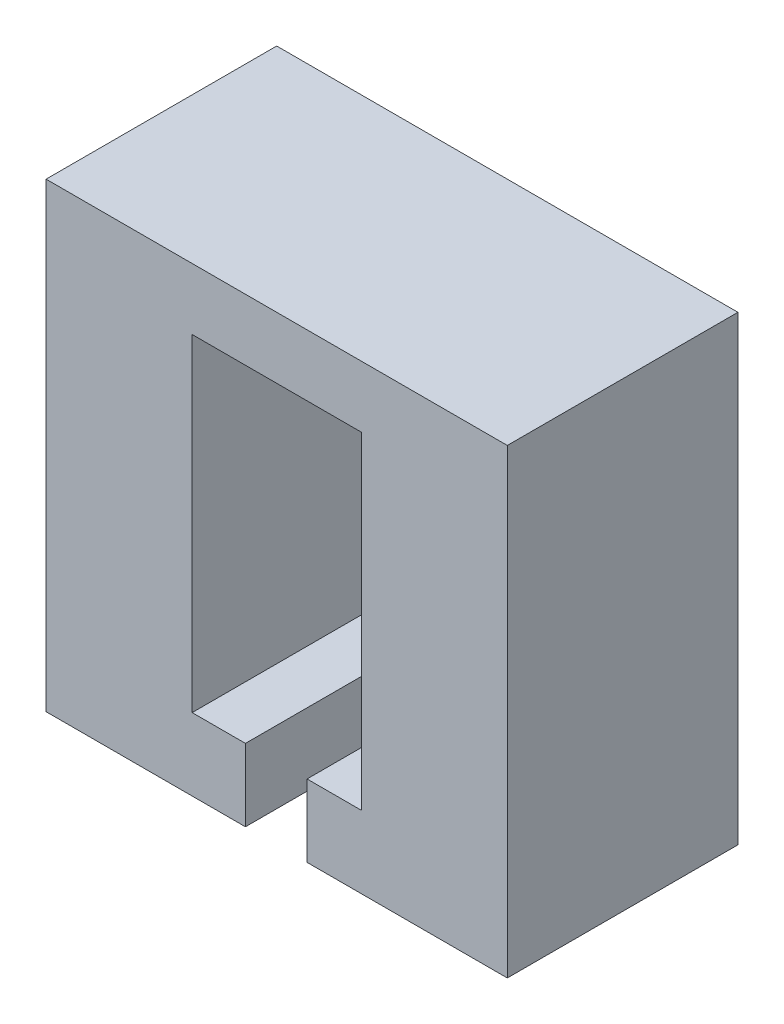
ISO-10303-21;
HEADER;
FILE_DESCRIPTION(('STEP AP214'),'2;1');
FILE_NAME('part.step','',(''),(''),'','','');
FILE_SCHEMA(('AUTOMOTIVE_DESIGN { 1 0 10303 214 1 1 1 1 }'));
ENDSEC;
DATA;
#1=APPLICATION_CONTEXT('core data for automotive mechanical design processes');
#2=APPLICATION_PROTOCOL_DEFINITION('international standard','automotive_design',2000,#1);
#3=PRODUCT_CONTEXT('',#1,'mechanical');
#4=PRODUCT('Part','Part','',(#3));
#5=PRODUCT_RELATED_PRODUCT_CATEGORY('part','',(#4));
#6=PRODUCT_DEFINITION_FORMATION('','',#4);
#7=PRODUCT_DEFINITION_CONTEXT('part definition',#1,'design');
#8=PRODUCT_DEFINITION('design','',#6,#7);
#9=PRODUCT_DEFINITION_SHAPE('','',#8);
#10=(LENGTH_UNIT() NAMED_UNIT(*) SI_UNIT(.MILLI.,.METRE.));
#11=(NAMED_UNIT(*) PLANE_ANGLE_UNIT() SI_UNIT($,.RADIAN.));
#12=(NAMED_UNIT(*) SI_UNIT($,.STERADIAN.) SOLID_ANGLE_UNIT());
#13=UNCERTAINTY_MEASURE_WITH_UNIT(LENGTH_MEASURE(1.E-05),#10,'distance_accuracy_value','');
#14=(GEOMETRIC_REPRESENTATION_CONTEXT(3) GLOBAL_UNCERTAINTY_ASSIGNED_CONTEXT((#13)) GLOBAL_UNIT_ASSIGNED_CONTEXT((#10,
#11,#12)) REPRESENTATION_CONTEXT('',''));
#15=CARTESIAN_POINT('',(0.,0.,0.));
#16=DIRECTION('',(0.,0.,1.));
#17=DIRECTION('',(1.,0.,0.));
#18=AXIS2_PLACEMENT_3D('',#15,#16,#17);
#19=CARTESIAN_POINT('',(32.6747297510417,-21.2506700204016,-22.6970424412041));
#20=DIRECTION('',(0.,1.,0.));
#21=DIRECTION('',(0.,0.,1.));
#22=AXIS2_PLACEMENT_3D('',#19,#20,#21);
#23=PLANE('',#22);
#24=DIRECTION('',(-1.,0.,0.));
#25=VECTOR('',#24,1.);
#26=CARTESIAN_POINT('',(32.6747297510417,-21.2506700204016,-22.6970424412041));
#27=LINE('',#26,#25);
#28=CARTESIAN_POINT('',(-1.39171189467113,-21.2506700204016,-22.6970424412041));
#29=VERTEX_POINT('',#28);
#30=CARTESIAN_POINT('',(-27.3252702489583,-21.2506700204016,-22.6970424412041));
#31=VERTEX_POINT('',#30);
#32=EDGE_CURVE('E181',#29,#31,#27,.T.);
#33=ORIENTED_EDGE('',*,*,#32,.F.);
#34=DIRECTION('',(0.,0.,-1.));
#35=VECTOR('',#34,1.);
#36=CARTESIAN_POINT('',(-1.39171189467113,-21.2506700204016,7.30295755879594));
#37=LINE('',#36,#35);
#38=CARTESIAN_POINT('',(-1.39171189467113,-21.2506700204016,7.30295755879594));
#39=VERTEX_POINT('',#38);
#40=EDGE_CURVE('E223',#39,#29,#37,.T.);
#41=ORIENTED_EDGE('',*,*,#40,.F.);
#42=DIRECTION('',(-1.,0.,0.));
#43=VECTOR('',#42,1.);
#44=CARTESIAN_POINT('',(32.6747297510417,-21.2506700204016,7.30295755879594));
#45=LINE('',#44,#43);
#46=CARTESIAN_POINT('',(-27.3252702489583,-21.2506700204016,7.30295755879594));
#47=VERTEX_POINT('',#46);
#48=EDGE_CURVE('E137',#39,#47,#45,.T.);
#49=ORIENTED_EDGE('',*,*,#48,.T.);
#50=DIRECTION('',(0.,0.,1.));
#51=VECTOR('',#50,1.);
#52=CARTESIAN_POINT('',(-27.3252702489583,-21.2506700204016,-22.6970424412041));
#53=LINE('',#52,#51);
#54=EDGE_CURVE('E42',#31,#47,#53,.T.);
#55=ORIENTED_EDGE('',*,*,#54,.F.);
#56=EDGE_LOOP('',(#33,#41,#49,#55));
#57=FACE_BOUND('',#56,.T.);
#58=ADVANCED_FACE('F34',(#57),#23,.F.);
#59=CARTESIAN_POINT('',(-8.32527024895831,-11.8506700204016,7.30295755879594));
#60=DIRECTION('',(0.,-1.,0.));
#61=DIRECTION('',(0.,0.,-1.));
#62=AXIS2_PLACEMENT_3D('',#59,#60,#61);
#63=PLANE('',#62);
#64=DIRECTION('',(-1.,0.,0.));
#65=VECTOR('',#64,1.);
#66=CARTESIAN_POINT('',(-8.32527024895831,-11.8506700204016,7.30295755879594));
#67=LINE('',#66,#65);
#68=CARTESIAN_POINT('',(-1.39171189467113,-11.8506700204016,7.30295755879594));
#69=VERTEX_POINT('',#68);
#70=CARTESIAN_POINT('',(-8.32527024895831,-11.8506700204016,7.30295755879594));
#71=VERTEX_POINT('',#70);
#72=EDGE_CURVE('E134',#69,#71,#67,.T.);
#73=ORIENTED_EDGE('',*,*,#72,.F.);
#74=DIRECTION('',(0.,0.,-1.));
#75=VECTOR('',#74,1.);
#76=CARTESIAN_POINT('',(-1.39171189467113,-11.8506700204016,7.30295755879594));
#77=LINE('',#76,#75);
#78=CARTESIAN_POINT('',(-1.39171189467113,-11.8506700204016,-22.6970424412041));
#79=VERTEX_POINT('',#78);
#80=EDGE_CURVE('E120',#69,#79,#77,.T.);
#81=ORIENTED_EDGE('',*,*,#80,.T.);
#82=DIRECTION('',(-1.,0.,0.));
#83=VECTOR('',#82,1.);
#84=CARTESIAN_POINT('',(-8.32527024895831,-11.8506700204016,-22.6970424412041));
#85=LINE('',#84,#83);
#86=CARTESIAN_POINT('',(-8.32527024895831,-11.8506700204016,-22.6970424412041));
#87=VERTEX_POINT('',#86);
#88=EDGE_CURVE('E165',#79,#87,#85,.T.);
#89=ORIENTED_EDGE('',*,*,#88,.T.);
#90=DIRECTION('',(0.,0.,-1.));
#91=VECTOR('',#90,1.);
#92=CARTESIAN_POINT('',(-8.32527024895831,-11.8506700204016,7.30295755879594));
#93=LINE('',#92,#91);
#94=EDGE_CURVE('E142',#71,#87,#93,.T.);
#95=ORIENTED_EDGE('',*,*,#94,.F.);
#96=EDGE_LOOP('',(#73,#81,#89,#95));
#97=FACE_BOUND('',#96,.T.);
#98=ADVANCED_FACE('F140',(#97),#63,.F.);
#99=CARTESIAN_POINT('',(32.6747297510417,-21.2506700204016,-22.6970424412041));
#100=DIRECTION('',(-1.,0.,0.));
#101=DIRECTION('',(0.,0.,1.));
#102=AXIS2_PLACEMENT_3D('',#99,#100,#101);
#103=PLANE('',#102);
#104=DIRECTION('',(0.,-1.,0.));
#105=VECTOR('',#104,1.);
#106=CARTESIAN_POINT('',(32.6747297510417,-21.2506700204016,7.30295755879594));
#107=LINE('',#106,#105);
#108=CARTESIAN_POINT('',(32.6747297510417,38.7493299795984,7.30295755879594));
#109=VERTEX_POINT('',#108);
#110=CARTESIAN_POINT('',(32.6747297510417,-21.2506700204016,7.30295755879594));
#111=VERTEX_POINT('',#110);
#112=EDGE_CURVE('E172',#109,#111,#107,.T.);
#113=ORIENTED_EDGE('',*,*,#112,.T.);
#114=DIRECTION('',(0.,0.,1.));
#115=VECTOR('',#114,1.);
#116=CARTESIAN_POINT('',(32.6747297510417,-21.2506700204016,-22.6970424412041));
#117=LINE('',#116,#115);
#118=CARTESIAN_POINT('',(32.6747297510417,-21.2506700204016,-22.6970424412041));
#119=VERTEX_POINT('',#118);
#120=EDGE_CURVE('E11',#119,#111,#117,.T.);
#121=ORIENTED_EDGE('',*,*,#120,.F.);
#122=DIRECTION('',(0.,-1.,0.));
#123=VECTOR('',#122,1.);
#124=CARTESIAN_POINT('',(32.6747297510417,-21.2506700204016,-22.6970424412041));
#125=LINE('',#124,#123);
#126=CARTESIAN_POINT('',(32.6747297510417,38.7493299795984,-22.6970424412041));
#127=VERTEX_POINT('',#126);
#128=EDGE_CURVE('E178',#127,#119,#125,.T.);
#129=ORIENTED_EDGE('',*,*,#128,.F.);
#130=DIRECTION('',(0.,0.,1.));
#131=VECTOR('',#130,1.);
#132=CARTESIAN_POINT('',(32.6747297510417,38.7493299795984,-22.6970424412041));
#133=LINE('',#132,#131);
#134=EDGE_CURVE('E190',#127,#109,#133,.T.);
#135=ORIENTED_EDGE('',*,*,#134,.T.);
#136=EDGE_LOOP('',(#113,#121,#129,#135));
#137=FACE_BOUND('',#136,.T.);
#138=ADVANCED_FACE('F36',(#137),#103,.F.);
#139=CARTESIAN_POINT('',(6.62396454166903,-21.2506700204016,7.30295755879594));
#140=VERTEX_POINT('',#139);
#141=EDGE_CURVE('E193',#111,#140,#45,.T.);
#142=ORIENTED_EDGE('',*,*,#141,.T.);
#143=DIRECTION('',(0.,0.,-1.));
#144=VECTOR('',#143,1.);
#145=CARTESIAN_POINT('',(6.62396454166903,-21.2506700204016,7.30295755879594));
#146=LINE('',#145,#144);
#147=CARTESIAN_POINT('',(6.62396454166903,-21.2506700204016,-22.6970424412041));
#148=VERTEX_POINT('',#147);
#149=EDGE_CURVE('E224',#140,#148,#146,.T.);
#150=ORIENTED_EDGE('',*,*,#149,.T.);
#151=EDGE_CURVE('E183',#119,#148,#27,.T.);
#152=ORIENTED_EDGE('',*,*,#151,.F.);
#153=ORIENTED_EDGE('',*,*,#120,.T.);
#154=EDGE_LOOP('',(#142,#150,#152,#153));
#155=FACE_BOUND('',#154,.T.);
#156=ADVANCED_FACE('F248',(#155),#23,.F.);
#157=CARTESIAN_POINT('',(-27.3252702489583,-21.2506700204016,-22.6970424412041));
#158=DIRECTION('',(1.,0.,0.));
#159=DIRECTION('',(0.,0.,-1.));
#160=AXIS2_PLACEMENT_3D('',#157,#158,#159);
#161=PLANE('',#160);
#162=DIRECTION('',(0.,1.,0.));
#163=VECTOR('',#162,1.);
#164=CARTESIAN_POINT('',(-27.3252702489583,-21.2506700204016,7.30295755879594));
#165=LINE('',#164,#163);
#166=CARTESIAN_POINT('',(-27.3252702489583,38.7493299795984,7.30295755879594));
#167=VERTEX_POINT('',#166);
#168=EDGE_CURVE('E196',#47,#167,#165,.T.);
#169=ORIENTED_EDGE('',*,*,#168,.T.);
#170=DIRECTION('',(0.,0.,1.));
#171=VECTOR('',#170,1.);
#172=CARTESIAN_POINT('',(-27.3252702489583,38.7493299795984,-22.6970424412041));
#173=LINE('',#172,#171);
#174=CARTESIAN_POINT('',(-27.3252702489583,38.7493299795984,-22.6970424412041));
#175=VERTEX_POINT('',#174);
#176=EDGE_CURVE('E201',#175,#167,#173,.T.);
#177=ORIENTED_EDGE('',*,*,#176,.F.);
#178=DIRECTION('',(0.,1.,0.));
#179=VECTOR('',#178,1.);
#180=CARTESIAN_POINT('',(-27.3252702489583,-21.2506700204016,-22.6970424412041));
#181=LINE('',#180,#179);
#182=EDGE_CURVE('E186',#31,#175,#181,.T.);
#183=ORIENTED_EDGE('',*,*,#182,.F.);
#184=ORIENTED_EDGE('',*,*,#54,.T.);
#185=EDGE_LOOP('',(#169,#177,#183,#184));
#186=FACE_BOUND('',#185,.T.);
#187=ADVANCED_FACE('F207',(#186),#161,.F.);
#188=CARTESIAN_POINT('',(32.6747297510417,38.7493299795984,-22.6970424412041));
#189=DIRECTION('',(0.,-1.,0.));
#190=DIRECTION('',(0.,0.,-1.));
#191=AXIS2_PLACEMENT_3D('',#188,#189,#190);
#192=PLANE('',#191);
#193=DIRECTION('',(1.,0.,0.));
#194=VECTOR('',#193,1.);
#195=CARTESIAN_POINT('',(32.6747297510417,38.7493299795984,7.30295755879594));
#196=LINE('',#195,#194);
#197=EDGE_CURVE('E182',#167,#109,#196,.T.);
#198=ORIENTED_EDGE('',*,*,#197,.T.);
#199=ORIENTED_EDGE('',*,*,#134,.F.);
#200=DIRECTION('',(1.,0.,0.));
#201=VECTOR('',#200,1.);
#202=CARTESIAN_POINT('',(32.6747297510417,38.7493299795984,-22.6970424412041));
#203=LINE('',#202,#201);
#204=EDGE_CURVE('E188',#175,#127,#203,.T.);
#205=ORIENTED_EDGE('',*,*,#204,.F.);
#206=ORIENTED_EDGE('',*,*,#176,.T.);
#207=EDGE_LOOP('',(#198,#199,#205,#206));
#208=FACE_BOUND('',#207,.T.);
#209=ADVANCED_FACE('F215',(#208),#192,.F.);
#210=CARTESIAN_POINT('',(0.,0.,-22.6970424412041));
#211=DIRECTION('',(0.,0.,1.));
#212=DIRECTION('',(1.,0.,0.));
#213=AXIS2_PLACEMENT_3D('',#210,#211,#212);
#214=PLANE('',#213);
#215=ORIENTED_EDGE('',*,*,#88,.F.);
#216=DIRECTION('',(0.,1.,0.));
#217=VECTOR('',#216,1.);
#218=CARTESIAN_POINT('',(-1.39171189467113,-11.8506700204016,-22.6970424412041));
#219=LINE('',#218,#217);
#220=EDGE_CURVE('E57',#29,#79,#219,.T.);
#221=ORIENTED_EDGE('',*,*,#220,.F.);
#222=ORIENTED_EDGE('',*,*,#32,.T.);
#223=ORIENTED_EDGE('',*,*,#182,.T.);
#224=ORIENTED_EDGE('',*,*,#204,.T.);
#225=ORIENTED_EDGE('',*,*,#128,.T.);
#226=ORIENTED_EDGE('',*,*,#151,.T.);
#227=DIRECTION('',(0.,-1.,0.));
#228=VECTOR('',#227,1.);
#229=CARTESIAN_POINT('',(6.62396454166903,-11.8506700204016,-22.6970424412041));
#230=LINE('',#229,#228);
#231=CARTESIAN_POINT('',(6.62396454166903,-11.8506700204016,-22.6970424412041));
#232=VERTEX_POINT('',#231);
#233=EDGE_CURVE('E138',#232,#148,#230,.T.);
#234=ORIENTED_EDGE('',*,*,#233,.F.);
#235=CARTESIAN_POINT('',(13.6747297510417,-11.8506700204016,-22.6970424412041));
#236=VERTEX_POINT('',#235);
#237=EDGE_CURVE('E161',#236,#232,#85,.T.);
#238=ORIENTED_EDGE('',*,*,#237,.F.);
#239=DIRECTION('',(0.,-1.,0.));
#240=VECTOR('',#239,1.);
#241=CARTESIAN_POINT('',(13.6747297510417,-11.8506700204016,-22.6970424412041));
#242=LINE('',#241,#240);
#243=CARTESIAN_POINT('',(13.6747297510417,30.7493299795984,-22.6970424412041));
#244=VERTEX_POINT('',#243);
#245=EDGE_CURVE('E145',#244,#236,#242,.T.);
#246=ORIENTED_EDGE('',*,*,#245,.F.);
#247=DIRECTION('',(1.,0.,0.));
#248=VECTOR('',#247,1.);
#249=CARTESIAN_POINT('',(-8.32527024895831,30.7493299795984,-22.6970424412041));
#250=LINE('',#249,#248);
#251=CARTESIAN_POINT('',(-8.32527024895831,30.7493299795984,-22.6970424412041));
#252=VERTEX_POINT('',#251);
#253=EDGE_CURVE('E150',#252,#244,#250,.T.);
#254=ORIENTED_EDGE('',*,*,#253,.F.);
#255=DIRECTION('',(0.,1.,0.));
#256=VECTOR('',#255,1.);
#257=CARTESIAN_POINT('',(-8.32527024895831,-11.8506700204016,-22.6970424412041));
#258=LINE('',#257,#256);
#259=EDGE_CURVE('E164',#87,#252,#258,.T.);
#260=ORIENTED_EDGE('',*,*,#259,.F.);
#261=EDGE_LOOP('',(#215,#221,#222,#223,#224,#225,#226,#234,#238,#246,#254,#260));
#262=FACE_BOUND('',#261,.T.);
#263=ADVANCED_FACE('F221',(#262),#214,.F.);
#264=CARTESIAN_POINT('',(0.,0.,7.30295755879594));
#265=DIRECTION('',(0.,0.,1.));
#266=DIRECTION('',(1.,0.,0.));
#267=AXIS2_PLACEMENT_3D('',#264,#265,#266);
#268=PLANE('',#267);
#269=DIRECTION('',(0.,1.,0.));
#270=VECTOR('',#269,1.);
#271=CARTESIAN_POINT('',(-1.39171189467113,-11.8506700204016,7.30295755879594));
#272=LINE('',#271,#270);
#273=EDGE_CURVE('E123',#39,#69,#272,.T.);
#274=ORIENTED_EDGE('',*,*,#273,.T.);
#275=ORIENTED_EDGE('',*,*,#72,.T.);
#276=DIRECTION('',(0.,1.,0.));
#277=VECTOR('',#276,1.);
#278=CARTESIAN_POINT('',(-8.32527024895831,-11.8506700204016,7.30295755879594));
#279=LINE('',#278,#277);
#280=CARTESIAN_POINT('',(-8.32527024895831,30.7493299795984,7.30295755879594));
#281=VERTEX_POINT('',#280);
#282=EDGE_CURVE('E148',#71,#281,#279,.T.);
#283=ORIENTED_EDGE('',*,*,#282,.T.);
#284=DIRECTION('',(1.,0.,0.));
#285=VECTOR('',#284,1.);
#286=CARTESIAN_POINT('',(-8.32527024895831,30.7493299795984,7.30295755879594));
#287=LINE('',#286,#285);
#288=CARTESIAN_POINT('',(13.6747297510417,30.7493299795984,7.30295755879594));
#289=VERTEX_POINT('',#288);
#290=EDGE_CURVE('E155',#281,#289,#287,.T.);
#291=ORIENTED_EDGE('',*,*,#290,.T.);
#292=DIRECTION('',(0.,-1.,0.));
#293=VECTOR('',#292,1.);
#294=CARTESIAN_POINT('',(13.6747297510417,-11.8506700204016,7.30295755879594));
#295=LINE('',#294,#293);
#296=CARTESIAN_POINT('',(13.6747297510417,-11.8506700204016,7.30295755879594));
#297=VERTEX_POINT('',#296);
#298=EDGE_CURVE('E158',#289,#297,#295,.T.);
#299=ORIENTED_EDGE('',*,*,#298,.T.);
#300=CARTESIAN_POINT('',(6.62396454166903,-11.8506700204016,7.30295755879594));
#301=VERTEX_POINT('',#300);
#302=EDGE_CURVE('E144',#297,#301,#67,.T.);
#303=ORIENTED_EDGE('',*,*,#302,.T.);
#304=DIRECTION('',(0.,-1.,0.));
#305=VECTOR('',#304,1.);
#306=CARTESIAN_POINT('',(6.62396454166903,-11.8506700204016,7.30295755879594));
#307=LINE('',#306,#305);
#308=EDGE_CURVE('E49',#301,#140,#307,.T.);
#309=ORIENTED_EDGE('',*,*,#308,.T.);
#310=ORIENTED_EDGE('',*,*,#141,.F.);
#311=ORIENTED_EDGE('',*,*,#112,.F.);
#312=ORIENTED_EDGE('',*,*,#197,.F.);
#313=ORIENTED_EDGE('',*,*,#168,.F.);
#314=ORIENTED_EDGE('',*,*,#48,.F.);
#315=EDGE_LOOP('',(#274,#275,#283,#291,#299,#303,#309,#310,#311,#312,#313,#314));
#316=FACE_BOUND('',#315,.T.);
#317=ADVANCED_FACE('F132',(#316),#268,.T.);
#318=ORIENTED_EDGE('',*,*,#237,.T.);
#319=DIRECTION('',(0.,0.,-1.));
#320=VECTOR('',#319,1.);
#321=CARTESIAN_POINT('',(6.62396454166903,-11.8506700204016,7.30295755879594));
#322=LINE('',#321,#320);
#323=EDGE_CURVE('E128',#301,#232,#322,.T.);
#324=ORIENTED_EDGE('',*,*,#323,.F.);
#325=ORIENTED_EDGE('',*,*,#302,.F.);
#326=DIRECTION('',(0.,0.,-1.));
#327=VECTOR('',#326,1.);
#328=CARTESIAN_POINT('',(13.6747297510417,-11.8506700204016,7.30295755879594));
#329=LINE('',#328,#327);
#330=EDGE_CURVE('E170',#297,#236,#329,.T.);
#331=ORIENTED_EDGE('',*,*,#330,.T.);
#332=EDGE_LOOP('',(#318,#324,#325,#331));
#333=FACE_BOUND('',#332,.T.);
#334=ADVANCED_FACE('F235',(#333),#63,.F.);
#335=CARTESIAN_POINT('',(13.6747297510417,-11.8506700204016,7.30295755879594));
#336=DIRECTION('',(1.,0.,0.));
#337=DIRECTION('',(0.,0.,-1.));
#338=AXIS2_PLACEMENT_3D('',#335,#336,#337);
#339=PLANE('',#338);
#340=ORIENTED_EDGE('',*,*,#245,.T.);
#341=ORIENTED_EDGE('',*,*,#330,.F.);
#342=ORIENTED_EDGE('',*,*,#298,.F.);
#343=DIRECTION('',(0.,0.,-1.));
#344=VECTOR('',#343,1.);
#345=CARTESIAN_POINT('',(13.6747297510417,30.7493299795984,7.30295755879594));
#346=LINE('',#345,#344);
#347=EDGE_CURVE('E173',#289,#244,#346,.T.);
#348=ORIENTED_EDGE('',*,*,#347,.T.);
#349=EDGE_LOOP('',(#340,#341,#342,#348));
#350=FACE_BOUND('',#349,.T.);
#351=ADVANCED_FACE('F238',(#350),#339,.F.);
#352=CARTESIAN_POINT('',(-8.32527024895831,30.7493299795984,7.30295755879594));
#353=DIRECTION('',(0.,1.,0.));
#354=DIRECTION('',(0.,0.,1.));
#355=AXIS2_PLACEMENT_3D('',#352,#353,#354);
#356=PLANE('',#355);
#357=ORIENTED_EDGE('',*,*,#253,.T.);
#358=ORIENTED_EDGE('',*,*,#347,.F.);
#359=ORIENTED_EDGE('',*,*,#290,.F.);
#360=DIRECTION('',(0.,0.,-1.));
#361=VECTOR('',#360,1.);
#362=CARTESIAN_POINT('',(-8.32527024895831,30.7493299795984,7.30295755879594));
#363=LINE('',#362,#361);
#364=EDGE_CURVE('E175',#281,#252,#363,.T.);
#365=ORIENTED_EDGE('',*,*,#364,.T.);
#366=EDGE_LOOP('',(#357,#358,#359,#365));
#367=FACE_BOUND('',#366,.T.);
#368=ADVANCED_FACE('F242',(#367),#356,.F.);
#369=CARTESIAN_POINT('',(-8.32527024895831,-11.8506700204016,7.30295755879594));
#370=DIRECTION('',(-1.,0.,0.));
#371=DIRECTION('',(0.,0.,1.));
#372=AXIS2_PLACEMENT_3D('',#369,#370,#371);
#373=PLANE('',#372);
#374=ORIENTED_EDGE('',*,*,#259,.T.);
#375=ORIENTED_EDGE('',*,*,#364,.F.);
#376=ORIENTED_EDGE('',*,*,#282,.F.);
#377=ORIENTED_EDGE('',*,*,#94,.T.);
#378=EDGE_LOOP('',(#374,#375,#376,#377));
#379=FACE_BOUND('',#378,.T.);
#380=ADVANCED_FACE('F245',(#379),#373,.F.);
#381=CARTESIAN_POINT('',(6.62396454166903,-11.8506700204016,7.30295755879594));
#382=DIRECTION('',(1.,0.,0.));
#383=DIRECTION('',(0.,0.,-1.));
#384=AXIS2_PLACEMENT_3D('',#381,#382,#383);
#385=PLANE('',#384);
#386=ORIENTED_EDGE('',*,*,#233,.T.);
#387=ORIENTED_EDGE('',*,*,#149,.F.);
#388=ORIENTED_EDGE('',*,*,#308,.F.);
#389=ORIENTED_EDGE('',*,*,#323,.T.);
#390=EDGE_LOOP('',(#386,#387,#388,#389));
#391=FACE_BOUND('',#390,.T.);
#392=ADVANCED_FACE('F230',(#391),#385,.F.);
#393=CARTESIAN_POINT('',(-1.39171189467113,-11.8506700204016,7.30295755879594));
#394=DIRECTION('',(-1.,0.,0.));
#395=DIRECTION('',(0.,0.,1.));
#396=AXIS2_PLACEMENT_3D('',#393,#394,#395);
#397=PLANE('',#396);
#398=ORIENTED_EDGE('',*,*,#220,.T.);
#399=ORIENTED_EDGE('',*,*,#80,.F.);
#400=ORIENTED_EDGE('',*,*,#273,.F.);
#401=ORIENTED_EDGE('',*,*,#40,.T.);
#402=EDGE_LOOP('',(#398,#399,#400,#401));
#403=FACE_BOUND('',#402,.T.);
#404=ADVANCED_FACE('F122',(#403),#397,.F.);
#405=CLOSED_SHELL('',(#58,#98,#138,#156,#187,#209,#263,#317,#334,#351,#368,#380,#392,#404));
#406=MANIFOLD_SOLID_BREP('B2',#405);
#407=ADVANCED_BREP_SHAPE_REPRESENTATION('',(#18,#406),#14);
#408=SHAPE_DEFINITION_REPRESENTATION(#9,#407);
ENDSEC;
END-ISO-10303-21;
